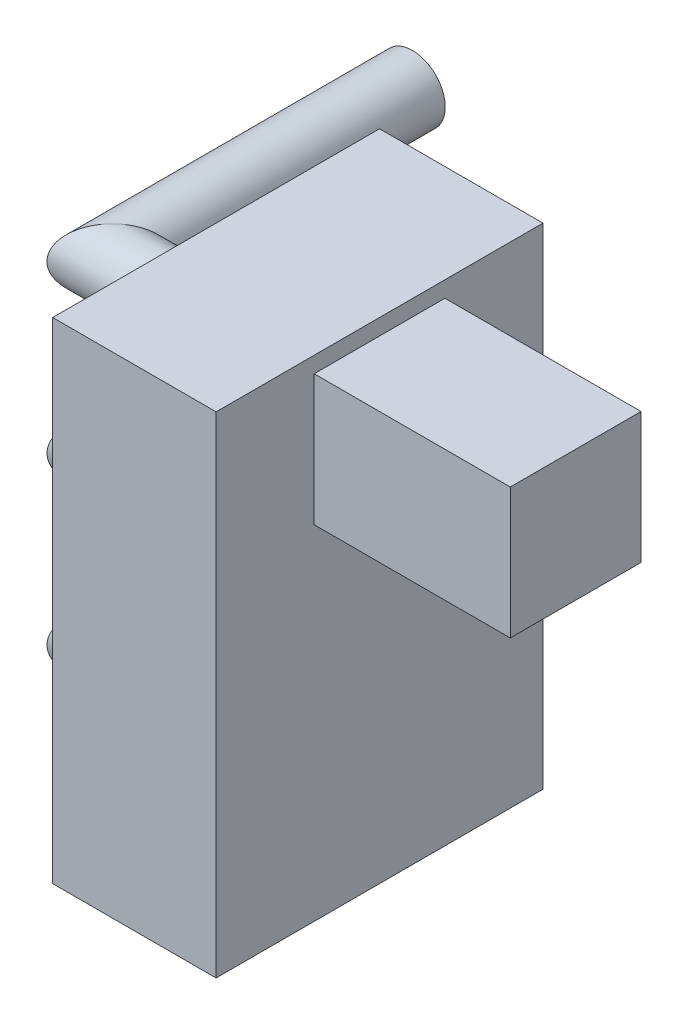
ISO-10303-21;
HEADER;
FILE_DESCRIPTION(('STEP AP214'),'2;1');
FILE_NAME('part.step','',(''),(''),'','','');
FILE_SCHEMA(('AUTOMOTIVE_DESIGN { 1 0 10303 214 1 1 1 1 }'));
ENDSEC;
DATA;
#1=APPLICATION_CONTEXT('core data for automotive mechanical design processes');
#2=APPLICATION_PROTOCOL_DEFINITION('international standard','automotive_design',2000,#1);
#3=PRODUCT_CONTEXT('',#1,'mechanical');
#4=PRODUCT('Part','Part','',(#3));
#5=PRODUCT_RELATED_PRODUCT_CATEGORY('part','',(#4));
#6=PRODUCT_DEFINITION_FORMATION('','',#4);
#7=PRODUCT_DEFINITION_CONTEXT('part definition',#1,'design');
#8=PRODUCT_DEFINITION('design','',#6,#7);
#9=PRODUCT_DEFINITION_SHAPE('','',#8);
#10=(LENGTH_UNIT() NAMED_UNIT(*) SI_UNIT(.MILLI.,.METRE.));
#11=(NAMED_UNIT(*) PLANE_ANGLE_UNIT() SI_UNIT($,.RADIAN.));
#12=(NAMED_UNIT(*) SI_UNIT($,.STERADIAN.) SOLID_ANGLE_UNIT());
#13=UNCERTAINTY_MEASURE_WITH_UNIT(LENGTH_MEASURE(1.E-05),#10,'distance_accuracy_value','');
#14=(GEOMETRIC_REPRESENTATION_CONTEXT(3) GLOBAL_UNCERTAINTY_ASSIGNED_CONTEXT((#13)) GLOBAL_UNIT_ASSIGNED_CONTEXT((#10,
#11,#12)) REPRESENTATION_CONTEXT('',''));
#15=CARTESIAN_POINT('',(0.,0.,0.));
#16=DIRECTION('',(0.,0.,1.));
#17=DIRECTION('',(1.,0.,0.));
#18=AXIS2_PLACEMENT_3D('',#15,#16,#17);
#19=CARTESIAN_POINT('',(0.,-6.2850094448126,5.));
#20=DIRECTION('',(1.,0.,0.));
#21=DIRECTION('',(0.,1.,0.));
#22=AXIS2_PLACEMENT_3D('',#19,#20,#21);
#23=PLANE('',#22);
#24=CARTESIAN_POINT('',(0.,-7.4950094448126,2.59211500664201));
#25=DIRECTION('',(-1.,0.,0.));
#26=DIRECTION('',(0.,-1.,0.));
#27=AXIS2_PLACEMENT_3D('',#24,#25,#26);
#28=CIRCLE('',#27,0.5);
#29=CARTESIAN_POINT('',(0.,-7.9950094448126,2.59211500664201));
#30=VERTEX_POINT('',#29);
#31=EDGE_CURVE('E48',#30,#30,#28,.T.);
#32=ORIENTED_EDGE('',*,*,#31,.F.);
#33=EDGE_LOOP('',(#32));
#34=FACE_BOUND('',#33,.T.);
#35=DIRECTION('',(0.,-1.,0.));
#36=VECTOR('',#35,1.);
#37=CARTESIAN_POINT('',(0.,-6.2850094448126,0.));
#38=LINE('',#37,#36);
#39=CARTESIAN_POINT('',(0.,-6.2850094448126,0.));
#40=VERTEX_POINT('',#39);
#41=CARTESIAN_POINT('',(0.,-13.7850094448126,0.));
#42=VERTEX_POINT('',#41);
#43=EDGE_CURVE('E127',#40,#42,#38,.T.);
#44=ORIENTED_EDGE('',*,*,#43,.T.);
#45=DIRECTION('',(0.,0.,-1.));
#46=VECTOR('',#45,1.);
#47=CARTESIAN_POINT('',(0.,-13.7850094448126,5.));
#48=LINE('',#47,#46);
#49=CARTESIAN_POINT('',(0.,-13.7850094448126,5.));
#50=VERTEX_POINT('',#49);
#51=EDGE_CURVE('E43',#50,#42,#48,.T.);
#52=ORIENTED_EDGE('',*,*,#51,.F.);
#53=DIRECTION('',(0.,-1.,0.));
#54=VECTOR('',#53,1.);
#55=CARTESIAN_POINT('',(0.,-6.2850094448126,5.));
#56=LINE('',#55,#54);
#57=CARTESIAN_POINT('',(0.,-6.2850094448126,5.));
#58=VERTEX_POINT('',#57);
#59=EDGE_CURVE('E136',#58,#50,#56,.T.);
#60=ORIENTED_EDGE('',*,*,#59,.F.);
#61=DIRECTION('',(0.,0.,-1.));
#62=VECTOR('',#61,1.);
#63=CARTESIAN_POINT('',(0.,-6.2850094448126,5.));
#64=LINE('',#63,#62);
#65=EDGE_CURVE('E145',#58,#40,#64,.T.);
#66=ORIENTED_EDGE('',*,*,#65,.T.);
#67=EDGE_LOOP('',(#44,#52,#60,#66));
#68=FACE_BOUND('',#67,.T.);
#69=CARTESIAN_POINT('',(0.,-10.0350094448126,2.59211500664201));
#70=DIRECTION('',(-1.,0.,0.));
#71=DIRECTION('',(0.,-1.,0.));
#72=AXIS2_PLACEMENT_3D('',#69,#70,#71);
#73=CIRCLE('',#72,0.5);
#74=CARTESIAN_POINT('',(0.,-10.5350094448126,2.59211500664201));
#75=VERTEX_POINT('',#74);
#76=EDGE_CURVE('E162',#75,#75,#73,.T.);
#77=ORIENTED_EDGE('',*,*,#76,.F.);
#78=EDGE_LOOP('',(#77));
#79=FACE_BOUND('',#78,.T.);
#80=CARTESIAN_POINT('',(0.,-12.5750094448126,2.59211500664201));
#81=DIRECTION('',(-1.,0.,0.));
#82=DIRECTION('',(0.,1.,0.));
#83=AXIS2_PLACEMENT_3D('',#80,#81,#82);
#84=CIRCLE('',#83,0.5);
#85=CARTESIAN_POINT('',(0.,-12.0750094448126,2.59211500664201));
#86=VERTEX_POINT('',#85);
#87=EDGE_CURVE('E12',#86,#86,#84,.T.);
#88=ORIENTED_EDGE('',*,*,#87,.F.);
#89=EDGE_LOOP('',(#88));
#90=FACE_BOUND('',#89,.T.);
#91=ADVANCED_FACE('F40',(#34,#68,#79,#90),#23,.F.);
#92=CARTESIAN_POINT('',(2.5,-6.2850094448126,5.));
#93=DIRECTION('',(-1.,0.,0.));
#94=DIRECTION('',(0.,-1.,0.));
#95=AXIS2_PLACEMENT_3D('',#92,#93,#94);
#96=PLANE('',#95);
#97=DIRECTION('',(0.,1.,0.));
#98=VECTOR('',#97,1.);
#99=CARTESIAN_POINT('',(2.5,-6.2850094448126,0.));
#100=LINE('',#99,#98);
#101=CARTESIAN_POINT('',(2.5,-13.7850094448126,0.));
#102=VERTEX_POINT('',#101);
#103=CARTESIAN_POINT('',(2.5,-6.2850094448126,0.));
#104=VERTEX_POINT('',#103);
#105=EDGE_CURVE('E148',#102,#104,#100,.T.);
#106=ORIENTED_EDGE('',*,*,#105,.T.);
#107=DIRECTION('',(0.,0.,-1.));
#108=VECTOR('',#107,1.);
#109=CARTESIAN_POINT('',(2.5,-6.2850094448126,5.));
#110=LINE('',#109,#108);
#111=CARTESIAN_POINT('',(2.5,-6.2850094448126,5.));
#112=VERTEX_POINT('',#111);
#113=EDGE_CURVE('E153',#112,#104,#110,.T.);
#114=ORIENTED_EDGE('',*,*,#113,.F.);
#115=DIRECTION('',(0.,1.,0.));
#116=VECTOR('',#115,1.);
#117=CARTESIAN_POINT('',(2.5,-6.2850094448126,5.));
#118=LINE('',#117,#116);
#119=CARTESIAN_POINT('',(2.5,-13.7850094448126,5.));
#120=VERTEX_POINT('',#119);
#121=EDGE_CURVE('E142',#120,#112,#118,.T.);
#122=ORIENTED_EDGE('',*,*,#121,.F.);
#123=DIRECTION('',(0.,0.,-1.));
#124=VECTOR('',#123,1.);
#125=CARTESIAN_POINT('',(2.5,-13.7850094448126,5.));
#126=LINE('',#125,#124);
#127=EDGE_CURVE('E155',#120,#102,#126,.T.);
#128=ORIENTED_EDGE('',*,*,#127,.T.);
#129=EDGE_LOOP('',(#106,#114,#122,#128));
#130=FACE_BOUND('',#129,.T.);
#131=DIRECTION('',(0.,1.,0.));
#132=VECTOR('',#131,1.);
#133=CARTESIAN_POINT('',(2.5,-6.53046433632642,1.5));
#134=LINE('',#133,#132);
#135=CARTESIAN_POINT('',(2.5,-8.53046433632642,1.5));
#136=VERTEX_POINT('',#135);
#137=CARTESIAN_POINT('',(2.5,-6.53046433632642,1.5));
#138=VERTEX_POINT('',#137);
#139=EDGE_CURVE('E126',#136,#138,#134,.T.);
#140=ORIENTED_EDGE('',*,*,#139,.F.);
#141=DIRECTION('',(0.,0.,-1.));
#142=VECTOR('',#141,1.);
#143=CARTESIAN_POINT('',(2.5,-8.53046433632642,1.5));
#144=LINE('',#143,#142);
#145=CARTESIAN_POINT('',(2.5,-8.53046433632642,3.5));
#146=VERTEX_POINT('',#145);
#147=EDGE_CURVE('E123',#146,#136,#144,.T.);
#148=ORIENTED_EDGE('',*,*,#147,.F.);
#149=DIRECTION('',(0.,-1.,0.));
#150=VECTOR('',#149,1.);
#151=CARTESIAN_POINT('',(2.5,-6.53046433632642,3.5));
#152=LINE('',#151,#150);
#153=CARTESIAN_POINT('',(2.5,-6.53046433632642,3.5));
#154=VERTEX_POINT('',#153);
#155=EDGE_CURVE('E61',#154,#146,#152,.T.);
#156=ORIENTED_EDGE('',*,*,#155,.F.);
#157=DIRECTION('',(0.,0.,1.));
#158=VECTOR('',#157,1.);
#159=CARTESIAN_POINT('',(2.5,-6.53046433632642,3.5));
#160=LINE('',#159,#158);
#161=EDGE_CURVE('E56',#138,#154,#160,.T.);
#162=ORIENTED_EDGE('',*,*,#161,.F.);
#163=EDGE_LOOP('',(#140,#148,#156,#162));
#164=FACE_BOUND('',#163,.T.);
#165=ADVANCED_FACE('F204',(#130,#164),#96,.F.);
#166=CARTESIAN_POINT('',(0.,-13.7850094448126,5.));
#167=DIRECTION('',(0.,1.,0.));
#168=DIRECTION('',(0.,0.,1.));
#169=AXIS2_PLACEMENT_3D('',#166,#167,#168);
#170=PLANE('',#169);
#171=DIRECTION('',(1.,0.,0.));
#172=VECTOR('',#171,1.);
#173=CARTESIAN_POINT('',(0.,-13.7850094448126,0.));
#174=LINE('',#173,#172);
#175=EDGE_CURVE('E130',#42,#102,#174,.T.);
#176=ORIENTED_EDGE('',*,*,#175,.T.);
#177=ORIENTED_EDGE('',*,*,#127,.F.);
#178=DIRECTION('',(1.,0.,0.));
#179=VECTOR('',#178,1.);
#180=CARTESIAN_POINT('',(0.,-13.7850094448126,5.));
#181=LINE('',#180,#179);
#182=EDGE_CURVE('E139',#50,#120,#181,.T.);
#183=ORIENTED_EDGE('',*,*,#182,.F.);
#184=ORIENTED_EDGE('',*,*,#51,.T.);
#185=EDGE_LOOP('',(#176,#177,#183,#184));
#186=FACE_BOUND('',#185,.T.);
#187=ADVANCED_FACE('F209',(#186),#170,.F.);
#188=CARTESIAN_POINT('',(0.,-6.2850094448126,5.));
#189=DIRECTION('',(0.,-1.,0.));
#190=DIRECTION('',(0.,0.,-1.));
#191=AXIS2_PLACEMENT_3D('',#188,#189,#190);
#192=PLANE('',#191);
#193=DIRECTION('',(-1.,0.,0.));
#194=VECTOR('',#193,1.);
#195=CARTESIAN_POINT('',(0.,-6.2850094448126,0.));
#196=LINE('',#195,#194);
#197=EDGE_CURVE('E140',#104,#40,#196,.T.);
#198=ORIENTED_EDGE('',*,*,#197,.T.);
#199=ORIENTED_EDGE('',*,*,#65,.F.);
#200=DIRECTION('',(-1.,0.,0.));
#201=VECTOR('',#200,1.);
#202=CARTESIAN_POINT('',(0.,-6.2850094448126,5.));
#203=LINE('',#202,#201);
#204=EDGE_CURVE('E144',#112,#58,#203,.T.);
#205=ORIENTED_EDGE('',*,*,#204,.F.);
#206=ORIENTED_EDGE('',*,*,#113,.T.);
#207=EDGE_LOOP('',(#198,#199,#205,#206));
#208=FACE_BOUND('',#207,.T.);
#209=ADVANCED_FACE('F377',(#208),#192,.F.);
#210=CARTESIAN_POINT('',(0.,-13.7850094448126,5.));
#211=DIRECTION('',(0.,0.,1.));
#212=DIRECTION('',(1.,0.,0.));
#213=AXIS2_PLACEMENT_3D('',#210,#211,#212);
#214=PLANE('',#213);
#215=ORIENTED_EDGE('',*,*,#59,.T.);
#216=ORIENTED_EDGE('',*,*,#182,.T.);
#217=ORIENTED_EDGE('',*,*,#121,.T.);
#218=ORIENTED_EDGE('',*,*,#204,.T.);
#219=EDGE_LOOP('',(#215,#216,#217,#218));
#220=FACE_BOUND('',#219,.T.);
#221=ADVANCED_FACE('F368',(#220),#214,.T.);
#222=CARTESIAN_POINT('',(0.,-13.7850094448126,0.));
#223=DIRECTION('',(0.,0.,1.));
#224=DIRECTION('',(1.,0.,0.));
#225=AXIS2_PLACEMENT_3D('',#222,#223,#224);
#226=PLANE('',#225);
#227=ORIENTED_EDGE('',*,*,#43,.F.);
#228=ORIENTED_EDGE('',*,*,#197,.F.);
#229=ORIENTED_EDGE('',*,*,#105,.F.);
#230=ORIENTED_EDGE('',*,*,#175,.F.);
#231=EDGE_LOOP('',(#227,#228,#229,#230));
#232=FACE_BOUND('',#231,.T.);
#233=ADVANCED_FACE('F355',(#232),#226,.F.);
#234=CARTESIAN_POINT('',(5.5,-6.53046433632642,1.5));
#235=DIRECTION('',(0.,0.,1.));
#236=DIRECTION('',(0.,-1.,0.));
#237=AXIS2_PLACEMENT_3D('',#234,#235,#236);
#238=PLANE('',#237);
#239=ORIENTED_EDGE('',*,*,#139,.T.);
#240=DIRECTION('',(-1.,0.,0.));
#241=VECTOR('',#240,1.);
#242=CARTESIAN_POINT('',(5.5,-6.53046433632642,1.5));
#243=LINE('',#242,#241);
#244=CARTESIAN_POINT('',(5.5,-6.53046433632642,1.5));
#245=VERTEX_POINT('',#244);
#246=EDGE_CURVE('E107',#245,#138,#243,.T.);
#247=ORIENTED_EDGE('',*,*,#246,.F.);
#248=DIRECTION('',(0.,1.,0.));
#249=VECTOR('',#248,1.);
#250=CARTESIAN_POINT('',(5.5,-6.53046433632642,1.5));
#251=LINE('',#250,#249);
#252=CARTESIAN_POINT('',(5.5,-8.53046433632642,1.5));
#253=VERTEX_POINT('',#252);
#254=EDGE_CURVE('E114',#253,#245,#251,.T.);
#255=ORIENTED_EDGE('',*,*,#254,.F.);
#256=DIRECTION('',(-1.,0.,0.));
#257=VECTOR('',#256,1.);
#258=CARTESIAN_POINT('',(5.5,-8.53046433632642,1.5));
#259=LINE('',#258,#257);
#260=EDGE_CURVE('E183',#253,#136,#259,.T.);
#261=ORIENTED_EDGE('',*,*,#260,.T.);
#262=EDGE_LOOP('',(#239,#247,#255,#261));
#263=FACE_BOUND('',#262,.T.);
#264=ADVANCED_FACE('F125',(#263),#238,.F.);
#265=CARTESIAN_POINT('',(5.5,-6.53046433632642,3.5));
#266=DIRECTION('',(0.,-1.,0.));
#267=DIRECTION('',(1.,0.,0.));
#268=AXIS2_PLACEMENT_3D('',#265,#266,#267);
#269=PLANE('',#268);
#270=ORIENTED_EDGE('',*,*,#161,.T.);
#271=DIRECTION('',(-1.,0.,0.));
#272=VECTOR('',#271,1.);
#273=CARTESIAN_POINT('',(5.5,-6.53046433632642,3.5));
#274=LINE('',#273,#272);
#275=CARTESIAN_POINT('',(5.5,-6.53046433632642,3.5));
#276=VERTEX_POINT('',#275);
#277=EDGE_CURVE('E110',#276,#154,#274,.T.);
#278=ORIENTED_EDGE('',*,*,#277,.F.);
#279=DIRECTION('',(0.,0.,1.));
#280=VECTOR('',#279,1.);
#281=CARTESIAN_POINT('',(5.5,-6.53046433632642,3.5));
#282=LINE('',#281,#280);
#283=EDGE_CURVE('E103',#245,#276,#282,.T.);
#284=ORIENTED_EDGE('',*,*,#283,.F.);
#285=ORIENTED_EDGE('',*,*,#246,.T.);
#286=EDGE_LOOP('',(#270,#278,#284,#285));
#287=FACE_BOUND('',#286,.T.);
#288=ADVANCED_FACE('F105',(#287),#269,.F.);
#289=CARTESIAN_POINT('',(5.5,-6.53046433632642,3.5));
#290=DIRECTION('',(0.,0.,-1.));
#291=DIRECTION('',(0.,1.,0.));
#292=AXIS2_PLACEMENT_3D('',#289,#290,#291);
#293=PLANE('',#292);
#294=ORIENTED_EDGE('',*,*,#155,.T.);
#295=DIRECTION('',(-1.,0.,0.));
#296=VECTOR('',#295,1.);
#297=CARTESIAN_POINT('',(5.5,-8.53046433632642,3.5));
#298=LINE('',#297,#296);
#299=CARTESIAN_POINT('',(5.5,-8.53046433632642,3.5));
#300=VERTEX_POINT('',#299);
#301=EDGE_CURVE('E132',#300,#146,#298,.T.);
#302=ORIENTED_EDGE('',*,*,#301,.F.);
#303=DIRECTION('',(0.,-1.,0.));
#304=VECTOR('',#303,1.);
#305=CARTESIAN_POINT('',(5.5,-6.53046433632642,3.5));
#306=LINE('',#305,#304);
#307=EDGE_CURVE('E113',#276,#300,#306,.T.);
#308=ORIENTED_EDGE('',*,*,#307,.F.);
#309=ORIENTED_EDGE('',*,*,#277,.T.);
#310=EDGE_LOOP('',(#294,#302,#308,#309));
#311=FACE_BOUND('',#310,.T.);
#312=ADVANCED_FACE('F194',(#311),#293,.F.);
#313=CARTESIAN_POINT('',(5.5,-8.53046433632642,1.5));
#314=DIRECTION('',(0.,1.,0.));
#315=DIRECTION('',(-1.,0.,0.));
#316=AXIS2_PLACEMENT_3D('',#313,#314,#315);
#317=PLANE('',#316);
#318=ORIENTED_EDGE('',*,*,#147,.T.);
#319=ORIENTED_EDGE('',*,*,#260,.F.);
#320=DIRECTION('',(0.,0.,-1.));
#321=VECTOR('',#320,1.);
#322=CARTESIAN_POINT('',(5.5,-8.53046433632642,1.5));
#323=LINE('',#322,#321);
#324=EDGE_CURVE('E119',#300,#253,#323,.T.);
#325=ORIENTED_EDGE('',*,*,#324,.F.);
#326=ORIENTED_EDGE('',*,*,#301,.T.);
#327=EDGE_LOOP('',(#318,#319,#325,#326));
#328=FACE_BOUND('',#327,.T.);
#329=ADVANCED_FACE('F192',(#328),#317,.F.);
#330=CARTESIAN_POINT('',(5.5,-8.53046433632642,1.5));
#331=DIRECTION('',(-1.,0.,0.));
#332=DIRECTION('',(0.,0.,1.));
#333=AXIS2_PLACEMENT_3D('',#330,#331,#332);
#334=PLANE('',#333);
#335=ORIENTED_EDGE('',*,*,#254,.T.);
#336=ORIENTED_EDGE('',*,*,#283,.T.);
#337=ORIENTED_EDGE('',*,*,#307,.T.);
#338=ORIENTED_EDGE('',*,*,#324,.T.);
#339=EDGE_LOOP('',(#335,#336,#337,#338));
#340=FACE_BOUND('',#339,.T.);
#341=ADVANCED_FACE('F117',(#340),#334,.F.);
#342=CARTESIAN_POINT('',(-1.49507065124231,-10.0350094448126,2.59211500664201));
#343=DIRECTION('',(0.,0.,-1.));
#344=DIRECTION('',(-1.,0.,0.));
#345=AXIS2_PLACEMENT_3D('',#342,#343,#344);
#346=CYLINDRICAL_SURFACE('',#345,0.5);
#347=CARTESIAN_POINT('',(-1.49507065124231,-10.0350094448126,2.59211500664201));
#348=DIRECTION('',(-0.707106781186547,0.,-0.707106781186548));
#349=DIRECTION('',(0.707106781186548,0.,-0.707106781186547));
#350=AXIS2_PLACEMENT_3D('',#347,#348,#349);
#351=ELLIPSE('',#350,0.707106781186547,0.5);
#352=CARTESIAN_POINT('',(-0.995070651242309,-10.0350094448126,2.09211500664201));
#353=VERTEX_POINT('',#352);
#354=EDGE_CURVE('E175',#353,#353,#351,.T.);
#355=ORIENTED_EDGE('',*,*,#354,.T.);
#356=EDGE_LOOP('',(#355));
#357=FACE_BOUND('',#356,.T.);
#358=CARTESIAN_POINT('',(-1.49507065124231,-10.0350094448126,-2.));
#359=DIRECTION('',(0.,0.,-1.));
#360=DIRECTION('',(-1.,0.,0.));
#361=AXIS2_PLACEMENT_3D('',#358,#359,#360);
#362=CIRCLE('',#361,0.5);
#363=CARTESIAN_POINT('',(-1.99507065124231,-10.0350094448126,-2.));
#364=VERTEX_POINT('',#363);
#365=EDGE_CURVE('E178',#364,#364,#362,.F.);
#366=ORIENTED_EDGE('',*,*,#365,.T.);
#367=EDGE_LOOP('',(#366));
#368=FACE_BOUND('',#367,.T.);
#369=ADVANCED_FACE('F262',(#357,#368),#346,.T.);
#370=CARTESIAN_POINT('',(-2.90928421361541,-10.0350094448126,2.59211500664201));
#371=DIRECTION('',(1.,0.,0.));
#372=DIRECTION('',(0.,0.,-1.));
#373=AXIS2_PLACEMENT_3D('',#370,#371,#372);
#374=CYLINDRICAL_SURFACE('',#373,0.5);
#375=ORIENTED_EDGE('',*,*,#76,.T.);
#376=EDGE_LOOP('',(#375));
#377=FACE_BOUND('',#376,.T.);
#378=ORIENTED_EDGE('',*,*,#354,.F.);
#379=EDGE_LOOP('',(#378));
#380=FACE_BOUND('',#379,.T.);
#381=ADVANCED_FACE('F258',(#377,#380),#374,.T.);
#382=CARTESIAN_POINT('',(-1.49507065124231,-10.0350094448126,-2.));
#383=DIRECTION('',(0.,0.,-1.));
#384=DIRECTION('',(-1.,0.,0.));
#385=AXIS2_PLACEMENT_3D('',#382,#383,#384);
#386=PLANE('',#385);
#387=ORIENTED_EDGE('',*,*,#365,.F.);
#388=EDGE_LOOP('',(#387));
#389=FACE_BOUND('',#388,.T.);
#390=ADVANCED_FACE('F255',(#389),#386,.T.);
#391=CARTESIAN_POINT('',(-1.49507065124231,-7.4950094448126,2.59211500664201));
#392=DIRECTION('',(0.,0.,-1.));
#393=DIRECTION('',(-1.,0.,0.));
#394=AXIS2_PLACEMENT_3D('',#391,#392,#393);
#395=CYLINDRICAL_SURFACE('',#394,0.5);
#396=CARTESIAN_POINT('',(-1.49507065124231,-7.4950094448126,2.59211500664201));
#397=DIRECTION('',(-0.707106781186547,0.,-0.707106781186548));
#398=DIRECTION('',(0.707106781186548,0.,-0.707106781186547));
#399=AXIS2_PLACEMENT_3D('',#396,#397,#398);
#400=ELLIPSE('',#399,0.707106781186547,0.5);
#401=CARTESIAN_POINT('',(-0.995070651242309,-7.4950094448126,2.09211500664201));
#402=VERTEX_POINT('',#401);
#403=EDGE_CURVE('E231',#402,#402,#400,.T.);
#404=ORIENTED_EDGE('',*,*,#403,.T.);
#405=EDGE_LOOP('',(#404));
#406=FACE_BOUND('',#405,.T.);
#407=CARTESIAN_POINT('',(-1.49507065124231,-7.4950094448126,-2.));
#408=DIRECTION('',(0.,0.,-1.));
#409=DIRECTION('',(-1.,0.,0.));
#410=AXIS2_PLACEMENT_3D('',#407,#408,#409);
#411=CIRCLE('',#410,0.5);
#412=CARTESIAN_POINT('',(-1.99507065124231,-7.4950094448126,-2.));
#413=VERTEX_POINT('',#412);
#414=EDGE_CURVE('E173',#413,#413,#411,.F.);
#415=ORIENTED_EDGE('',*,*,#414,.T.);
#416=EDGE_LOOP('',(#415));
#417=FACE_BOUND('',#416,.T.);
#418=ADVANCED_FACE('F239',(#406,#417),#395,.T.);
#419=CARTESIAN_POINT('',(-2.9092842136154,-7.4950094448126,2.59211500664201));
#420=DIRECTION('',(1.,0.,0.));
#421=DIRECTION('',(0.,0.,-1.));
#422=AXIS2_PLACEMENT_3D('',#419,#420,#421);
#423=CYLINDRICAL_SURFACE('',#422,0.5);
#424=ORIENTED_EDGE('',*,*,#31,.T.);
#425=EDGE_LOOP('',(#424));
#426=FACE_BOUND('',#425,.T.);
#427=ORIENTED_EDGE('',*,*,#403,.F.);
#428=EDGE_LOOP('',(#427));
#429=FACE_BOUND('',#428,.T.);
#430=ADVANCED_FACE('F243',(#426,#429),#423,.T.);
#431=CARTESIAN_POINT('',(-1.49507065124231,-7.4950094448126,-2.));
#432=DIRECTION('',(0.,0.,-1.));
#433=DIRECTION('',(-1.,0.,0.));
#434=AXIS2_PLACEMENT_3D('',#431,#432,#433);
#435=PLANE('',#434);
#436=ORIENTED_EDGE('',*,*,#414,.F.);
#437=EDGE_LOOP('',(#436));
#438=FACE_BOUND('',#437,.T.);
#439=ADVANCED_FACE('F241',(#438),#435,.T.);
#440=CARTESIAN_POINT('',(-1.49507065124231,-12.5750094448126,2.59211500664201));
#441=DIRECTION('',(0.,0.,-1.));
#442=DIRECTION('',(-1.,0.,0.));
#443=AXIS2_PLACEMENT_3D('',#440,#441,#442);
#444=CYLINDRICAL_SURFACE('',#443,0.5);
#445=CARTESIAN_POINT('',(-1.49507065124231,-12.5750094448126,2.59211500664201));
#446=DIRECTION('',(-0.707106781186547,0.,-0.707106781186548));
#447=DIRECTION('',(0.707106781186548,0.,-0.707106781186547));
#448=AXIS2_PLACEMENT_3D('',#445,#446,#447);
#449=ELLIPSE('',#448,0.707106781186548,0.5);
#450=CARTESIAN_POINT('',(-0.995070651242309,-12.5750094448126,2.09211500664201));
#451=VERTEX_POINT('',#450);
#452=EDGE_CURVE('E226',#451,#451,#449,.T.);
#453=ORIENTED_EDGE('',*,*,#452,.T.);
#454=EDGE_LOOP('',(#453));
#455=FACE_BOUND('',#454,.T.);
#456=CARTESIAN_POINT('',(-1.49507065124231,-12.5750094448126,-2.));
#457=DIRECTION('',(0.,0.,-1.));
#458=DIRECTION('',(-1.,0.,0.));
#459=AXIS2_PLACEMENT_3D('',#456,#457,#458);
#460=CIRCLE('',#459,0.5);
#461=CARTESIAN_POINT('',(-1.99507065124231,-12.5750094448126,-2.));
#462=VERTEX_POINT('',#461);
#463=EDGE_CURVE('E228',#462,#462,#460,.F.);
#464=ORIENTED_EDGE('',*,*,#463,.T.);
#465=EDGE_LOOP('',(#464));
#466=FACE_BOUND('',#465,.T.);
#467=ADVANCED_FACE('F222',(#455,#466),#444,.T.);
#468=CARTESIAN_POINT('',(-2.9092842136154,-12.5750094448126,2.59211500664201));
#469=DIRECTION('',(1.,0.,0.));
#470=DIRECTION('',(0.,0.,-1.));
#471=AXIS2_PLACEMENT_3D('',#468,#469,#470);
#472=CYLINDRICAL_SURFACE('',#471,0.5);
#473=ORIENTED_EDGE('',*,*,#87,.T.);
#474=EDGE_LOOP('',(#473));
#475=FACE_BOUND('',#474,.T.);
#476=ORIENTED_EDGE('',*,*,#452,.F.);
#477=EDGE_LOOP('',(#476));
#478=FACE_BOUND('',#477,.T.);
#479=ADVANCED_FACE('F218',(#475,#478),#472,.T.);
#480=CARTESIAN_POINT('',(-1.49507065124231,-12.5750094448126,-2.));
#481=DIRECTION('',(0.,0.,-1.));
#482=DIRECTION('',(-1.,0.,0.));
#483=AXIS2_PLACEMENT_3D('',#480,#481,#482);
#484=PLANE('',#483);
#485=ORIENTED_EDGE('',*,*,#463,.F.);
#486=EDGE_LOOP('',(#485));
#487=FACE_BOUND('',#486,.T.);
#488=ADVANCED_FACE('F221',(#487),#484,.T.);
#489=CLOSED_SHELL('',(#91,#165,#187,#209,#221,#233,#264,#288,#312,#329,#341,#369,#381,#390,#418,
#430,#439,#467,#479,#488));
#490=MANIFOLD_SOLID_BREP('B2',#489);
#491=ADVANCED_BREP_SHAPE_REPRESENTATION('',(#18,#490),#14);
#492=SHAPE_DEFINITION_REPRESENTATION(#9,#491);
ENDSEC;
END-ISO-10303-21;
